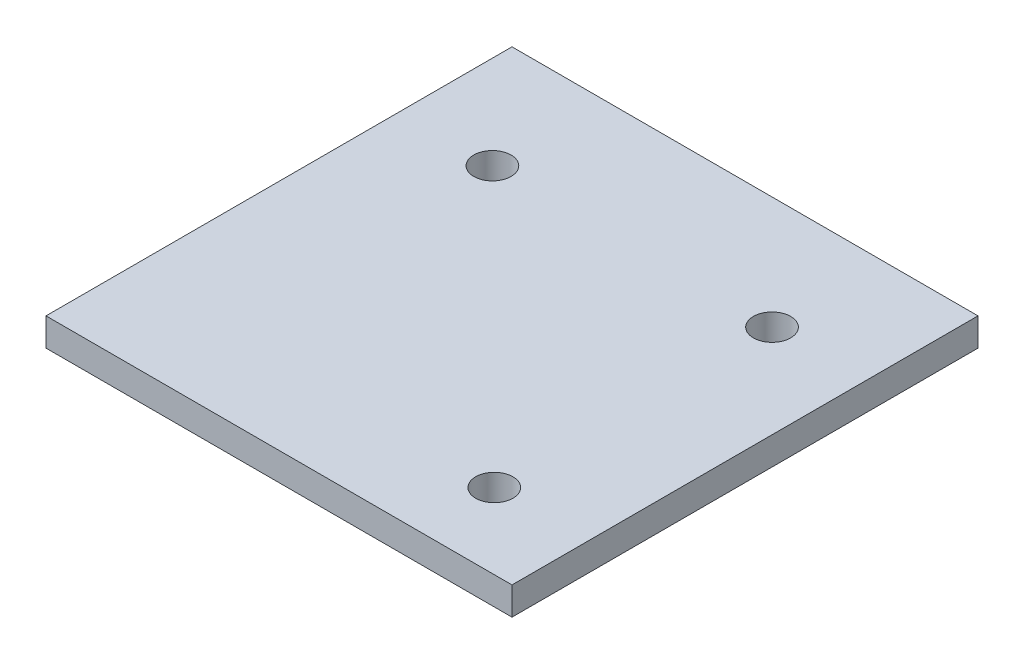
ISO-10303-21;
HEADER;
FILE_DESCRIPTION(('STEP AP214'),'2;1');
FILE_NAME('part.step','',(''),(''),'','','');
FILE_SCHEMA(('AUTOMOTIVE_DESIGN { 1 0 10303 214 1 1 1 1 }'));
ENDSEC;
DATA;
#1=APPLICATION_CONTEXT('core data for automotive mechanical design processes');
#2=APPLICATION_PROTOCOL_DEFINITION('international standard','automotive_design',2000,#1);
#3=PRODUCT_CONTEXT('',#1,'mechanical');
#4=PRODUCT('Part','Part','',(#3));
#5=PRODUCT_RELATED_PRODUCT_CATEGORY('part','',(#4));
#6=PRODUCT_DEFINITION_FORMATION('','',#4);
#7=PRODUCT_DEFINITION_CONTEXT('part definition',#1,'design');
#8=PRODUCT_DEFINITION('design','',#6,#7);
#9=PRODUCT_DEFINITION_SHAPE('','',#8);
#10=(LENGTH_UNIT() NAMED_UNIT(*) SI_UNIT(.MILLI.,.METRE.));
#11=(NAMED_UNIT(*) PLANE_ANGLE_UNIT() SI_UNIT($,.RADIAN.));
#12=(NAMED_UNIT(*) SI_UNIT($,.STERADIAN.) SOLID_ANGLE_UNIT());
#13=UNCERTAINTY_MEASURE_WITH_UNIT(LENGTH_MEASURE(1.E-05),#10,'distance_accuracy_value','');
#14=(GEOMETRIC_REPRESENTATION_CONTEXT(3) GLOBAL_UNCERTAINTY_ASSIGNED_CONTEXT((#13)) GLOBAL_UNIT_ASSIGNED_CONTEXT((#10,
#11,#12)) REPRESENTATION_CONTEXT('',''));
#15=CARTESIAN_POINT('',(0.,0.,0.));
#16=DIRECTION('',(0.,0.,1.));
#17=DIRECTION('',(1.,0.,0.));
#18=AXIS2_PLACEMENT_3D('',#15,#16,#17);
#19=CARTESIAN_POINT('',(25.,3.,25.));
#20=DIRECTION('',(-1.,0.,0.));
#21=DIRECTION('',(0.,0.,1.));
#22=AXIS2_PLACEMENT_3D('',#19,#20,#21);
#23=PLANE('',#22);
#24=DIRECTION('',(0.,0.,-1.));
#25=VECTOR('',#24,1.);
#26=CARTESIAN_POINT('',(25.,0.,25.));
#27=LINE('',#26,#25);
#28=CARTESIAN_POINT('',(25.,0.,25.));
#29=VERTEX_POINT('',#28);
#30=CARTESIAN_POINT('',(25.,0.,-25.));
#31=VERTEX_POINT('',#30);
#32=EDGE_CURVE('E102',#29,#31,#27,.T.);
#33=ORIENTED_EDGE('',*,*,#32,.T.);
#34=DIRECTION('',(0.,-1.,0.));
#35=VECTOR('',#34,1.);
#36=CARTESIAN_POINT('',(25.,3.,-25.));
#37=LINE('',#36,#35);
#38=CARTESIAN_POINT('',(25.,3.,-25.));
#39=VERTEX_POINT('',#38);
#40=EDGE_CURVE('E11',#39,#31,#37,.T.);
#41=ORIENTED_EDGE('',*,*,#40,.F.);
#42=DIRECTION('',(0.,0.,-1.));
#43=VECTOR('',#42,1.);
#44=CARTESIAN_POINT('',(25.,3.,25.));
#45=LINE('',#44,#43);
#46=CARTESIAN_POINT('',(25.,3.,25.));
#47=VERTEX_POINT('',#46);
#48=EDGE_CURVE('E90',#47,#39,#45,.T.);
#49=ORIENTED_EDGE('',*,*,#48,.F.);
#50=DIRECTION('',(0.,-1.,0.));
#51=VECTOR('',#50,1.);
#52=CARTESIAN_POINT('',(25.,3.,25.));
#53=LINE('',#52,#51);
#54=EDGE_CURVE('E98',#47,#29,#53,.T.);
#55=ORIENTED_EDGE('',*,*,#54,.T.);
#56=EDGE_LOOP('',(#33,#41,#49,#55));
#57=FACE_BOUND('',#56,.T.);
#58=ADVANCED_FACE('F39',(#57),#23,.F.);
#59=CARTESIAN_POINT('',(-25.,3.,-25.));
#60=DIRECTION('',(0.,0.,1.));
#61=DIRECTION('',(1.,0.,0.));
#62=AXIS2_PLACEMENT_3D('',#59,#60,#61);
#63=PLANE('',#62);
#64=DIRECTION('',(-1.,0.,0.));
#65=VECTOR('',#64,1.);
#66=CARTESIAN_POINT('',(-25.,0.,-25.));
#67=LINE('',#66,#65);
#68=CARTESIAN_POINT('',(-25.,0.,-25.));
#69=VERTEX_POINT('',#68);
#70=EDGE_CURVE('E94',#31,#69,#67,.T.);
#71=ORIENTED_EDGE('',*,*,#70,.T.);
#72=DIRECTION('',(0.,-1.,0.));
#73=VECTOR('',#72,1.);
#74=CARTESIAN_POINT('',(-25.,3.,-25.));
#75=LINE('',#74,#73);
#76=CARTESIAN_POINT('',(-25.,3.,-25.));
#77=VERTEX_POINT('',#76);
#78=EDGE_CURVE('E47',#77,#69,#75,.T.);
#79=ORIENTED_EDGE('',*,*,#78,.F.);
#80=DIRECTION('',(-1.,0.,0.));
#81=VECTOR('',#80,1.);
#82=CARTESIAN_POINT('',(-25.,3.,-25.));
#83=LINE('',#82,#81);
#84=EDGE_CURVE('E85',#39,#77,#83,.T.);
#85=ORIENTED_EDGE('',*,*,#84,.F.);
#86=ORIENTED_EDGE('',*,*,#40,.T.);
#87=EDGE_LOOP('',(#71,#79,#85,#86));
#88=FACE_BOUND('',#87,.T.);
#89=ADVANCED_FACE('F93',(#88),#63,.F.);
#90=CARTESIAN_POINT('',(-25.,3.,25.));
#91=DIRECTION('',(1.,0.,0.));
#92=DIRECTION('',(0.,0.,-1.));
#93=AXIS2_PLACEMENT_3D('',#90,#91,#92);
#94=PLANE('',#93);
#95=DIRECTION('',(0.,0.,1.));
#96=VECTOR('',#95,1.);
#97=CARTESIAN_POINT('',(-25.,0.,25.));
#98=LINE('',#97,#96);
#99=CARTESIAN_POINT('',(-25.,0.,25.));
#100=VERTEX_POINT('',#99);
#101=EDGE_CURVE('E72',#69,#100,#98,.T.);
#102=ORIENTED_EDGE('',*,*,#101,.T.);
#103=DIRECTION('',(0.,-1.,0.));
#104=VECTOR('',#103,1.);
#105=CARTESIAN_POINT('',(-25.,3.,25.));
#106=LINE('',#105,#104);
#107=CARTESIAN_POINT('',(-25.,3.,25.));
#108=VERTEX_POINT('',#107);
#109=EDGE_CURVE('E95',#108,#100,#106,.T.);
#110=ORIENTED_EDGE('',*,*,#109,.F.);
#111=DIRECTION('',(0.,0.,1.));
#112=VECTOR('',#111,1.);
#113=CARTESIAN_POINT('',(-25.,3.,25.));
#114=LINE('',#113,#112);
#115=EDGE_CURVE('E88',#77,#108,#114,.T.);
#116=ORIENTED_EDGE('',*,*,#115,.F.);
#117=ORIENTED_EDGE('',*,*,#78,.T.);
#118=EDGE_LOOP('',(#102,#110,#116,#117));
#119=FACE_BOUND('',#118,.T.);
#120=ADVANCED_FACE('F96',(#119),#94,.F.);
#121=CARTESIAN_POINT('',(-25.,3.,25.));
#122=DIRECTION('',(0.,0.,-1.));
#123=DIRECTION('',(-1.,0.,0.));
#124=AXIS2_PLACEMENT_3D('',#121,#122,#123);
#125=PLANE('',#124);
#126=DIRECTION('',(1.,0.,0.));
#127=VECTOR('',#126,1.);
#128=CARTESIAN_POINT('',(-25.,0.,25.));
#129=LINE('',#128,#127);
#130=EDGE_CURVE('E78',#100,#29,#129,.T.);
#131=ORIENTED_EDGE('',*,*,#130,.T.);
#132=ORIENTED_EDGE('',*,*,#54,.F.);
#133=DIRECTION('',(1.,0.,0.));
#134=VECTOR('',#133,1.);
#135=CARTESIAN_POINT('',(-25.,3.,25.));
#136=LINE('',#135,#134);
#137=EDGE_CURVE('E55',#108,#47,#136,.T.);
#138=ORIENTED_EDGE('',*,*,#137,.F.);
#139=ORIENTED_EDGE('',*,*,#109,.T.);
#140=EDGE_LOOP('',(#131,#132,#138,#139));
#141=FACE_BOUND('',#140,.T.);
#142=ADVANCED_FACE('F110',(#141),#125,.F.);
#143=CARTESIAN_POINT('',(0.,3.,0.));
#144=DIRECTION('',(0.,-1.,0.));
#145=DIRECTION('',(0.,0.,-1.));
#146=AXIS2_PLACEMENT_3D('',#143,#144,#145);
#147=PLANE('',#146);
#148=CARTESIAN_POINT('',(15.,3.,16.9));
#149=DIRECTION('',(0.,1.,0.));
#150=DIRECTION('',(0.,0.,1.));
#151=AXIS2_PLACEMENT_3D('',#148,#149,#150);
#152=CIRCLE('',#151,2.);
#153=CARTESIAN_POINT('',(15.,3.,18.9));
#154=VERTEX_POINT('',#153);
#155=EDGE_CURVE('E120',#154,#154,#152,.T.);
#156=ORIENTED_EDGE('',*,*,#155,.F.);
#157=EDGE_LOOP('',(#156));
#158=FACE_BOUND('',#157,.T.);
#159=CARTESIAN_POINT('',(-15.,3.,-12.9));
#160=DIRECTION('',(0.,1.,0.));
#161=DIRECTION('',(0.,0.,1.));
#162=AXIS2_PLACEMENT_3D('',#159,#160,#161);
#163=CIRCLE('',#162,2.);
#164=CARTESIAN_POINT('',(-15.,3.,-10.9));
#165=VERTEX_POINT('',#164);
#166=EDGE_CURVE('E105',#165,#165,#163,.T.);
#167=ORIENTED_EDGE('',*,*,#166,.F.);
#168=EDGE_LOOP('',(#167));
#169=FACE_BOUND('',#168,.T.);
#170=CARTESIAN_POINT('',(15.,3.,-12.9));
#171=DIRECTION('',(0.,1.,0.));
#172=DIRECTION('',(0.,0.,1.));
#173=AXIS2_PLACEMENT_3D('',#170,#171,#172);
#174=CIRCLE('',#173,2.);
#175=CARTESIAN_POINT('',(15.,3.,-10.9));
#176=VERTEX_POINT('',#175);
#177=EDGE_CURVE('E116',#176,#176,#174,.T.);
#178=ORIENTED_EDGE('',*,*,#177,.F.);
#179=EDGE_LOOP('',(#178));
#180=FACE_BOUND('',#179,.T.);
#181=ORIENTED_EDGE('',*,*,#48,.T.);
#182=ORIENTED_EDGE('',*,*,#84,.T.);
#183=ORIENTED_EDGE('',*,*,#115,.T.);
#184=ORIENTED_EDGE('',*,*,#137,.T.);
#185=EDGE_LOOP('',(#181,#182,#183,#184));
#186=FACE_BOUND('',#185,.T.);
#187=ADVANCED_FACE('F86',(#158,#169,#180,#186),#147,.F.);
#188=CARTESIAN_POINT('',(0.,0.,0.));
#189=DIRECTION('',(0.,-1.,0.));
#190=DIRECTION('',(0.,0.,-1.));
#191=AXIS2_PLACEMENT_3D('',#188,#189,#190);
#192=PLANE('',#191);
#193=CARTESIAN_POINT('',(15.,0.,16.9));
#194=DIRECTION('',(0.,-1.,0.));
#195=DIRECTION('',(0.,0.,-1.));
#196=AXIS2_PLACEMENT_3D('',#193,#194,#195);
#197=CIRCLE('',#196,2.);
#198=CARTESIAN_POINT('',(15.,0.,18.9));
#199=VERTEX_POINT('',#198);
#200=EDGE_CURVE('E128',#199,#199,#197,.F.);
#201=ORIENTED_EDGE('',*,*,#200,.T.);
#202=EDGE_LOOP('',(#201));
#203=FACE_BOUND('',#202,.T.);
#204=CARTESIAN_POINT('',(-15.,0.,-12.9));
#205=DIRECTION('',(0.,-1.,0.));
#206=DIRECTION('',(0.,0.,-1.));
#207=AXIS2_PLACEMENT_3D('',#204,#205,#206);
#208=CIRCLE('',#207,2.);
#209=CARTESIAN_POINT('',(-15.,0.,-10.9));
#210=VERTEX_POINT('',#209);
#211=EDGE_CURVE('E123',#210,#210,#208,.F.);
#212=ORIENTED_EDGE('',*,*,#211,.T.);
#213=EDGE_LOOP('',(#212));
#214=FACE_BOUND('',#213,.T.);
#215=CARTESIAN_POINT('',(15.,0.,-12.9));
#216=DIRECTION('',(0.,-1.,0.));
#217=DIRECTION('',(0.,0.,-1.));
#218=AXIS2_PLACEMENT_3D('',#215,#216,#217);
#219=CIRCLE('',#218,2.);
#220=CARTESIAN_POINT('',(15.,0.,-10.9));
#221=VERTEX_POINT('',#220);
#222=EDGE_CURVE('E119',#221,#221,#219,.F.);
#223=ORIENTED_EDGE('',*,*,#222,.T.);
#224=EDGE_LOOP('',(#223));
#225=FACE_BOUND('',#224,.T.);
#226=ORIENTED_EDGE('',*,*,#32,.F.);
#227=ORIENTED_EDGE('',*,*,#130,.F.);
#228=ORIENTED_EDGE('',*,*,#101,.F.);
#229=ORIENTED_EDGE('',*,*,#70,.F.);
#230=EDGE_LOOP('',(#226,#227,#228,#229));
#231=FACE_BOUND('',#230,.T.);
#232=ADVANCED_FACE('F113',(#203,#214,#225,#231),#192,.T.);
#233=CARTESIAN_POINT('',(15.,-0.00100000000000013,-12.9));
#234=DIRECTION('',(0.,1.,0.));
#235=DIRECTION('',(0.,0.,1.));
#236=AXIS2_PLACEMENT_3D('',#233,#234,#235);
#237=CYLINDRICAL_SURFACE('',#236,2.);
#238=CARTESIAN_POINT('',(15.,0.,-10.9));
#239=CARTESIAN_POINT('',(15.,0.03125,-10.9));
#240=CARTESIAN_POINT('',(15.,0.0625,-10.9));
#241=CARTESIAN_POINT('',(15.,0.125,-10.9));
#242=CARTESIAN_POINT('',(15.,0.15625,-10.9));
#243=CARTESIAN_POINT('',(15.,0.21875,-10.9));
#244=CARTESIAN_POINT('',(15.,0.25,-10.9));
#245=CARTESIAN_POINT('',(15.,0.3125,-10.9));
#246=CARTESIAN_POINT('',(15.,0.34375,-10.9));
#247=CARTESIAN_POINT('',(15.,0.40625,-10.9));
#248=CARTESIAN_POINT('',(15.,0.4375,-10.9));
#249=CARTESIAN_POINT('',(15.,0.5,-10.9));
#250=CARTESIAN_POINT('',(15.,0.53125,-10.9));
#251=CARTESIAN_POINT('',(15.,0.59375,-10.9));
#252=CARTESIAN_POINT('',(15.,0.625,-10.9));
#253=CARTESIAN_POINT('',(15.,0.6875,-10.9));
#254=CARTESIAN_POINT('',(15.,0.71875,-10.9));
#255=CARTESIAN_POINT('',(15.,0.78125,-10.9));
#256=CARTESIAN_POINT('',(15.,0.8125,-10.9));
#257=CARTESIAN_POINT('',(15.,0.875,-10.9));
#258=CARTESIAN_POINT('',(15.,0.90625,-10.9));
#259=CARTESIAN_POINT('',(15.,0.96875,-10.9));
#260=CARTESIAN_POINT('',(15.,1.,-10.9));
#261=CARTESIAN_POINT('',(15.,1.0625,-10.9));
#262=CARTESIAN_POINT('',(15.,1.09375,-10.9));
#263=CARTESIAN_POINT('',(15.,1.15625,-10.9));
#264=CARTESIAN_POINT('',(15.,1.1875,-10.9));
#265=CARTESIAN_POINT('',(15.,1.25,-10.9));
#266=CARTESIAN_POINT('',(15.,1.28125,-10.9));
#267=CARTESIAN_POINT('',(15.,1.34375,-10.9));
#268=CARTESIAN_POINT('',(15.,1.375,-10.9));
#269=CARTESIAN_POINT('',(15.,1.4375,-10.9));
#270=CARTESIAN_POINT('',(15.,1.46875,-10.9));
#271=CARTESIAN_POINT('',(15.,1.53125,-10.9));
#272=CARTESIAN_POINT('',(15.,1.5625,-10.9));
#273=CARTESIAN_POINT('',(15.,1.625,-10.9));
#274=CARTESIAN_POINT('',(15.,1.65625,-10.9));
#275=CARTESIAN_POINT('',(15.,1.71875,-10.9));
#276=CARTESIAN_POINT('',(15.,1.75,-10.9));
#277=CARTESIAN_POINT('',(15.,1.8125,-10.9));
#278=CARTESIAN_POINT('',(15.,1.84375,-10.9));
#279=CARTESIAN_POINT('',(15.,1.90625,-10.9));
#280=CARTESIAN_POINT('',(15.,1.9375,-10.9));
#281=CARTESIAN_POINT('',(15.,2.,-10.9));
#282=CARTESIAN_POINT('',(15.,2.03125,-10.9));
#283=CARTESIAN_POINT('',(15.,2.09375,-10.9));
#284=CARTESIAN_POINT('',(15.,2.125,-10.9));
#285=CARTESIAN_POINT('',(15.,2.1875,-10.9));
#286=CARTESIAN_POINT('',(15.,2.21875,-10.9));
#287=CARTESIAN_POINT('',(15.,2.28125,-10.9));
#288=CARTESIAN_POINT('',(15.,2.3125,-10.9));
#289=CARTESIAN_POINT('',(15.,2.375,-10.9));
#290=CARTESIAN_POINT('',(15.,2.40625,-10.9));
#291=CARTESIAN_POINT('',(15.,2.46875,-10.9));
#292=CARTESIAN_POINT('',(15.,2.5,-10.9));
#293=CARTESIAN_POINT('',(15.,2.5625,-10.9));
#294=CARTESIAN_POINT('',(15.,2.59375,-10.9));
#295=CARTESIAN_POINT('',(15.,2.65625,-10.9));
#296=CARTESIAN_POINT('',(15.,2.6875,-10.9));
#297=CARTESIAN_POINT('',(15.,2.75,-10.9));
#298=CARTESIAN_POINT('',(15.,2.78125,-10.9));
#299=CARTESIAN_POINT('',(15.,2.84375,-10.9));
#300=CARTESIAN_POINT('',(15.,2.875,-10.9));
#301=CARTESIAN_POINT('',(15.,2.9375,-10.9));
#302=CARTESIAN_POINT('',(15.,2.96875,-10.9));
#303=CARTESIAN_POINT('',(15.,3.,-10.9));
#304=B_SPLINE_CURVE_WITH_KNOTS('',3,(#238,#239,#240,#241,#242,#243,#244,#245,#246,#247,#248,
#249,#250,#251,#252,#253,#254,#255,#256,#257,#258,#259,#260,#261,#262,#263,#264,#265,#266,#267,
#268,#269,#270,#271,#272,#273,#274,#275,#276,#277,#278,#279,#280,#281,#282,#283,#284,#285,#286,
#287,#288,#289,#290,#291,#292,#293,#294,#295,#296,#297,#298,#299,#300,#301,#302,#303),
.UNSPECIFIED.,.F.,.F.,(4,2,2,2,2,2,2,2,2,2,2,2,2,2,2,2,2,2,2,2,2,2,2,2,2,2,2,2,2,2,2,2,4),(0.,
0.09375,0.1875,0.28125,0.375,0.46875,0.5625,0.65625,0.75,0.84375,0.9375,1.03125,1.125,1.21875,
1.3125,1.40625,1.5,1.59375,1.6875,1.78125,1.875,1.96875,2.0625,2.15625,2.25,2.34375,2.4375,
2.53125,2.625,2.71875,2.8125,2.90625,3.),.UNSPECIFIED.);
#305=EDGE_CURVE('BSEAM143',#221,#176,#304,.T.);
#306=ORIENTED_EDGE('',*,*,#222,.F.);
#307=ORIENTED_EDGE('',*,*,#177,.T.);
#308=ORIENTED_EDGE('',*,*,#305,.T.);
#309=ORIENTED_EDGE('',*,*,#305,.F.);
#310=EDGE_LOOP('',(#306,#308,#307,#309));
#311=FACE_BOUND('',#310,.T.);
#312=ADVANCED_FACE('F143',(#311),#237,.F.);
#313=CARTESIAN_POINT('',(-15.,-0.00100000000000013,-12.9));
#314=DIRECTION('',(0.,1.,0.));
#315=DIRECTION('',(0.,0.,1.));
#316=AXIS2_PLACEMENT_3D('',#313,#314,#315);
#317=CYLINDRICAL_SURFACE('',#316,2.);
#318=CARTESIAN_POINT('',(-15.,0.,-10.9));
#319=CARTESIAN_POINT('',(-15.,0.03125,-10.9));
#320=CARTESIAN_POINT('',(-15.,0.0625,-10.9));
#321=CARTESIAN_POINT('',(-15.,0.125,-10.9));
#322=CARTESIAN_POINT('',(-15.,0.15625,-10.9));
#323=CARTESIAN_POINT('',(-15.,0.21875,-10.9));
#324=CARTESIAN_POINT('',(-15.,0.25,-10.9));
#325=CARTESIAN_POINT('',(-15.,0.3125,-10.9));
#326=CARTESIAN_POINT('',(-15.,0.34375,-10.9));
#327=CARTESIAN_POINT('',(-15.,0.40625,-10.9));
#328=CARTESIAN_POINT('',(-15.,0.4375,-10.9));
#329=CARTESIAN_POINT('',(-15.,0.5,-10.9));
#330=CARTESIAN_POINT('',(-15.,0.53125,-10.9));
#331=CARTESIAN_POINT('',(-15.,0.59375,-10.9));
#332=CARTESIAN_POINT('',(-15.,0.625,-10.9));
#333=CARTESIAN_POINT('',(-15.,0.6875,-10.9));
#334=CARTESIAN_POINT('',(-15.,0.71875,-10.9));
#335=CARTESIAN_POINT('',(-15.,0.78125,-10.9));
#336=CARTESIAN_POINT('',(-15.,0.8125,-10.9));
#337=CARTESIAN_POINT('',(-15.,0.875,-10.9));
#338=CARTESIAN_POINT('',(-15.,0.90625,-10.9));
#339=CARTESIAN_POINT('',(-15.,0.96875,-10.9));
#340=CARTESIAN_POINT('',(-15.,1.,-10.9));
#341=CARTESIAN_POINT('',(-15.,1.0625,-10.9));
#342=CARTESIAN_POINT('',(-15.,1.09375,-10.9));
#343=CARTESIAN_POINT('',(-15.,1.15625,-10.9));
#344=CARTESIAN_POINT('',(-15.,1.1875,-10.9));
#345=CARTESIAN_POINT('',(-15.,1.25,-10.9));
#346=CARTESIAN_POINT('',(-15.,1.28125,-10.9));
#347=CARTESIAN_POINT('',(-15.,1.34375,-10.9));
#348=CARTESIAN_POINT('',(-15.,1.375,-10.9));
#349=CARTESIAN_POINT('',(-15.,1.4375,-10.9));
#350=CARTESIAN_POINT('',(-15.,1.46875,-10.9));
#351=CARTESIAN_POINT('',(-15.,1.53125,-10.9));
#352=CARTESIAN_POINT('',(-15.,1.5625,-10.9));
#353=CARTESIAN_POINT('',(-15.,1.625,-10.9));
#354=CARTESIAN_POINT('',(-15.,1.65625,-10.9));
#355=CARTESIAN_POINT('',(-15.,1.71875,-10.9));
#356=CARTESIAN_POINT('',(-15.,1.75,-10.9));
#357=CARTESIAN_POINT('',(-15.,1.8125,-10.9));
#358=CARTESIAN_POINT('',(-15.,1.84375,-10.9));
#359=CARTESIAN_POINT('',(-15.,1.90625,-10.9));
#360=CARTESIAN_POINT('',(-15.,1.9375,-10.9));
#361=CARTESIAN_POINT('',(-15.,2.,-10.9));
#362=CARTESIAN_POINT('',(-15.,2.03125,-10.9));
#363=CARTESIAN_POINT('',(-15.,2.09375,-10.9));
#364=CARTESIAN_POINT('',(-15.,2.125,-10.9));
#365=CARTESIAN_POINT('',(-15.,2.1875,-10.9));
#366=CARTESIAN_POINT('',(-15.,2.21875,-10.9));
#367=CARTESIAN_POINT('',(-15.,2.28125,-10.9));
#368=CARTESIAN_POINT('',(-15.,2.3125,-10.9));
#369=CARTESIAN_POINT('',(-15.,2.375,-10.9));
#370=CARTESIAN_POINT('',(-15.,2.40625,-10.9));
#371=CARTESIAN_POINT('',(-15.,2.46875,-10.9));
#372=CARTESIAN_POINT('',(-15.,2.5,-10.9));
#373=CARTESIAN_POINT('',(-15.,2.5625,-10.9));
#374=CARTESIAN_POINT('',(-15.,2.59375,-10.9));
#375=CARTESIAN_POINT('',(-15.,2.65625,-10.9));
#376=CARTESIAN_POINT('',(-15.,2.6875,-10.9));
#377=CARTESIAN_POINT('',(-15.,2.75,-10.9));
#378=CARTESIAN_POINT('',(-15.,2.78125,-10.9));
#379=CARTESIAN_POINT('',(-15.,2.84375,-10.9));
#380=CARTESIAN_POINT('',(-15.,2.875,-10.9));
#381=CARTESIAN_POINT('',(-15.,2.9375,-10.9));
#382=CARTESIAN_POINT('',(-15.,2.96875,-10.9));
#383=CARTESIAN_POINT('',(-15.,3.,-10.9));
#384=B_SPLINE_CURVE_WITH_KNOTS('',3,(#318,#319,#320,#321,#322,#323,#324,#325,#326,#327,#328,
#329,#330,#331,#332,#333,#334,#335,#336,#337,#338,#339,#340,#341,#342,#343,#344,#345,#346,#347,
#348,#349,#350,#351,#352,#353,#354,#355,#356,#357,#358,#359,#360,#361,#362,#363,#364,#365,#366,
#367,#368,#369,#370,#371,#372,#373,#374,#375,#376,#377,#378,#379,#380,#381,#382,#383),
.UNSPECIFIED.,.F.,.F.,(4,2,2,2,2,2,2,2,2,2,2,2,2,2,2,2,2,2,2,2,2,2,2,2,2,2,2,2,2,2,2,2,4),(0.,
0.09375,0.1875,0.28125,0.375,0.46875,0.5625,0.65625,0.75,0.84375,0.9375,1.03125,1.125,1.21875,
1.3125,1.40625,1.5,1.59375,1.6875,1.78125,1.875,1.96875,2.0625,2.15625,2.25,2.34375,2.4375,
2.53125,2.625,2.71875,2.8125,2.90625,3.),.UNSPECIFIED.);
#385=EDGE_CURVE('BSEAM145',#210,#165,#384,.T.);
#386=ORIENTED_EDGE('',*,*,#211,.F.);
#387=ORIENTED_EDGE('',*,*,#166,.T.);
#388=ORIENTED_EDGE('',*,*,#385,.T.);
#389=ORIENTED_EDGE('',*,*,#385,.F.);
#390=EDGE_LOOP('',(#386,#388,#387,#389));
#391=FACE_BOUND('',#390,.T.);
#392=ADVANCED_FACE('F145',(#391),#317,.F.);
#393=CARTESIAN_POINT('',(15.,-0.00100000000000013,16.9));
#394=DIRECTION('',(0.,1.,0.));
#395=DIRECTION('',(0.,0.,1.));
#396=AXIS2_PLACEMENT_3D('',#393,#394,#395);
#397=CYLINDRICAL_SURFACE('',#396,2.);
#398=CARTESIAN_POINT('',(15.,0.,18.9));
#399=CARTESIAN_POINT('',(15.,0.03125,18.9));
#400=CARTESIAN_POINT('',(15.,0.0625,18.9));
#401=CARTESIAN_POINT('',(15.,0.125,18.9));
#402=CARTESIAN_POINT('',(15.,0.15625,18.9));
#403=CARTESIAN_POINT('',(15.,0.21875,18.9));
#404=CARTESIAN_POINT('',(15.,0.25,18.9));
#405=CARTESIAN_POINT('',(15.,0.3125,18.9));
#406=CARTESIAN_POINT('',(15.,0.34375,18.9));
#407=CARTESIAN_POINT('',(15.,0.40625,18.9));
#408=CARTESIAN_POINT('',(15.,0.4375,18.9));
#409=CARTESIAN_POINT('',(15.,0.5,18.9));
#410=CARTESIAN_POINT('',(15.,0.53125,18.9));
#411=CARTESIAN_POINT('',(15.,0.59375,18.9));
#412=CARTESIAN_POINT('',(15.,0.625,18.9));
#413=CARTESIAN_POINT('',(15.,0.6875,18.9));
#414=CARTESIAN_POINT('',(15.,0.71875,18.9));
#415=CARTESIAN_POINT('',(15.,0.78125,18.9));
#416=CARTESIAN_POINT('',(15.,0.8125,18.9));
#417=CARTESIAN_POINT('',(15.,0.875,18.9));
#418=CARTESIAN_POINT('',(15.,0.90625,18.9));
#419=CARTESIAN_POINT('',(15.,0.96875,18.9));
#420=CARTESIAN_POINT('',(15.,1.,18.9));
#421=CARTESIAN_POINT('',(15.,1.0625,18.9));
#422=CARTESIAN_POINT('',(15.,1.09375,18.9));
#423=CARTESIAN_POINT('',(15.,1.15625,18.9));
#424=CARTESIAN_POINT('',(15.,1.1875,18.9));
#425=CARTESIAN_POINT('',(15.,1.25,18.9));
#426=CARTESIAN_POINT('',(15.,1.28125,18.9));
#427=CARTESIAN_POINT('',(15.,1.34375,18.9));
#428=CARTESIAN_POINT('',(15.,1.375,18.9));
#429=CARTESIAN_POINT('',(15.,1.4375,18.9));
#430=CARTESIAN_POINT('',(15.,1.46875,18.9));
#431=CARTESIAN_POINT('',(15.,1.53125,18.9));
#432=CARTESIAN_POINT('',(15.,1.5625,18.9));
#433=CARTESIAN_POINT('',(15.,1.625,18.9));
#434=CARTESIAN_POINT('',(15.,1.65625,18.9));
#435=CARTESIAN_POINT('',(15.,1.71875,18.9));
#436=CARTESIAN_POINT('',(15.,1.75,18.9));
#437=CARTESIAN_POINT('',(15.,1.8125,18.9));
#438=CARTESIAN_POINT('',(15.,1.84375,18.9));
#439=CARTESIAN_POINT('',(15.,1.90625,18.9));
#440=CARTESIAN_POINT('',(15.,1.9375,18.9));
#441=CARTESIAN_POINT('',(15.,2.,18.9));
#442=CARTESIAN_POINT('',(15.,2.03125,18.9));
#443=CARTESIAN_POINT('',(15.,2.09375,18.9));
#444=CARTESIAN_POINT('',(15.,2.125,18.9));
#445=CARTESIAN_POINT('',(15.,2.1875,18.9));
#446=CARTESIAN_POINT('',(15.,2.21875,18.9));
#447=CARTESIAN_POINT('',(15.,2.28125,18.9));
#448=CARTESIAN_POINT('',(15.,2.3125,18.9));
#449=CARTESIAN_POINT('',(15.,2.375,18.9));
#450=CARTESIAN_POINT('',(15.,2.40625,18.9));
#451=CARTESIAN_POINT('',(15.,2.46875,18.9));
#452=CARTESIAN_POINT('',(15.,2.5,18.9));
#453=CARTESIAN_POINT('',(15.,2.5625,18.9));
#454=CARTESIAN_POINT('',(15.,2.59375,18.9));
#455=CARTESIAN_POINT('',(15.,2.65625,18.9));
#456=CARTESIAN_POINT('',(15.,2.6875,18.9));
#457=CARTESIAN_POINT('',(15.,2.75,18.9));
#458=CARTESIAN_POINT('',(15.,2.78125,18.9));
#459=CARTESIAN_POINT('',(15.,2.84375,18.9));
#460=CARTESIAN_POINT('',(15.,2.875,18.9));
#461=CARTESIAN_POINT('',(15.,2.9375,18.9));
#462=CARTESIAN_POINT('',(15.,2.96875,18.9));
#463=CARTESIAN_POINT('',(15.,3.,18.9));
#464=B_SPLINE_CURVE_WITH_KNOTS('',3,(#398,#399,#400,#401,#402,#403,#404,#405,#406,#407,#408,
#409,#410,#411,#412,#413,#414,#415,#416,#417,#418,#419,#420,#421,#422,#423,#424,#425,#426,#427,
#428,#429,#430,#431,#432,#433,#434,#435,#436,#437,#438,#439,#440,#441,#442,#443,#444,#445,#446,
#447,#448,#449,#450,#451,#452,#453,#454,#455,#456,#457,#458,#459,#460,#461,#462,#463),
.UNSPECIFIED.,.F.,.F.,(4,2,2,2,2,2,2,2,2,2,2,2,2,2,2,2,2,2,2,2,2,2,2,2,2,2,2,2,2,2,2,2,4),(0.,
0.09375,0.1875,0.28125,0.375,0.46875,0.5625,0.65625,0.75,0.84375,0.9375,1.03125,1.125,1.21875,
1.3125,1.40625,1.5,1.59375,1.6875,1.78125,1.875,1.96875,2.0625,2.15625,2.25,2.34375,2.4375,
2.53125,2.625,2.71875,2.8125,2.90625,3.),.UNSPECIFIED.);
#465=EDGE_CURVE('BSEAM134',#199,#154,#464,.T.);
#466=ORIENTED_EDGE('',*,*,#200,.F.);
#467=ORIENTED_EDGE('',*,*,#155,.T.);
#468=ORIENTED_EDGE('',*,*,#465,.T.);
#469=ORIENTED_EDGE('',*,*,#465,.F.);
#470=EDGE_LOOP('',(#466,#468,#467,#469));
#471=FACE_BOUND('',#470,.T.);
#472=ADVANCED_FACE('F134',(#471),#397,.F.);
#473=CLOSED_SHELL('',(#58,#89,#120,#142,#187,#232,#312,#392,#472));
#474=MANIFOLD_SOLID_BREP('B2',#473);
#475=ADVANCED_BREP_SHAPE_REPRESENTATION('',(#18,#474),#14);
#476=SHAPE_DEFINITION_REPRESENTATION(#9,#475);
ENDSEC;
END-ISO-10303-21;
